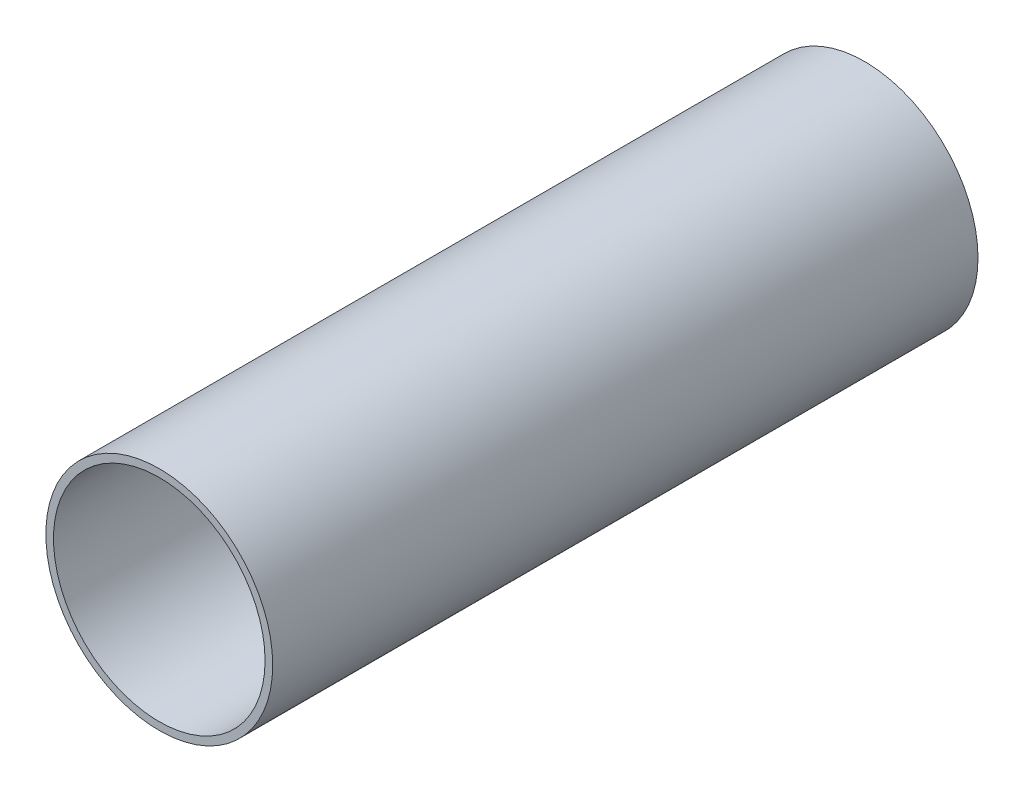
ISO-10303-21;
HEADER;
FILE_DESCRIPTION(('STEP AP214'),'2;1');
FILE_NAME('part.step','',(''),(''),'','','');
FILE_SCHEMA(('AUTOMOTIVE_DESIGN { 1 0 10303 214 1 1 1 1 }'));
ENDSEC;
DATA;
#1=APPLICATION_CONTEXT('core data for automotive mechanical design processes');
#2=APPLICATION_PROTOCOL_DEFINITION('international standard','automotive_design',2000,#1);
#3=PRODUCT_CONTEXT('',#1,'mechanical');
#4=PRODUCT('Part','Part','',(#3));
#5=PRODUCT_RELATED_PRODUCT_CATEGORY('part','',(#4));
#6=PRODUCT_DEFINITION_FORMATION('','',#4);
#7=PRODUCT_DEFINITION_CONTEXT('part definition',#1,'design');
#8=PRODUCT_DEFINITION('design','',#6,#7);
#9=PRODUCT_DEFINITION_SHAPE('','',#8);
#10=(LENGTH_UNIT() NAMED_UNIT(*) SI_UNIT(.MILLI.,.METRE.));
#11=(NAMED_UNIT(*) PLANE_ANGLE_UNIT() SI_UNIT($,.RADIAN.));
#12=(NAMED_UNIT(*) SI_UNIT($,.STERADIAN.) SOLID_ANGLE_UNIT());
#13=UNCERTAINTY_MEASURE_WITH_UNIT(LENGTH_MEASURE(1.E-05),#10,'distance_accuracy_value','');
#14=(GEOMETRIC_REPRESENTATION_CONTEXT(3) GLOBAL_UNCERTAINTY_ASSIGNED_CONTEXT((#13)) GLOBAL_UNIT_ASSIGNED_CONTEXT((#10,
#11,#12)) REPRESENTATION_CONTEXT('',''));
#15=CARTESIAN_POINT('',(0.,0.,0.));
#16=DIRECTION('',(0.,0.,1.));
#17=DIRECTION('',(1.,0.,0.));
#18=AXIS2_PLACEMENT_3D('',#15,#16,#17);
#19=CARTESIAN_POINT('',(0.,0.,60.));
#20=DIRECTION('',(0.,0.,1.));
#21=DIRECTION('',(1.,0.,0.));
#22=AXIS2_PLACEMENT_3D('',#19,#20,#21);
#23=PLANE('',#22);
#24=CARTESIAN_POINT('',(0.,0.,60.));
#25=DIRECTION('',(0.,0.,1.));
#26=DIRECTION('',(1.,0.,0.));
#27=AXIS2_PLACEMENT_3D('',#24,#25,#26);
#28=CIRCLE('',#27,9.65);
#29=CARTESIAN_POINT('',(9.65,0.,60.));
#30=VERTEX_POINT('',#29);
#31=EDGE_CURVE('E12',#30,#30,#28,.T.);
#32=ORIENTED_EDGE('',*,*,#31,.T.);
#33=EDGE_LOOP('',(#32));
#34=FACE_BOUND('',#33,.T.);
#35=CARTESIAN_POINT('',(0.,0.,60.));
#36=DIRECTION('',(0.,0.,1.));
#37=DIRECTION('',(1.,0.,0.));
#38=AXIS2_PLACEMENT_3D('',#35,#36,#37);
#39=CIRCLE('',#38,9.);
#40=CARTESIAN_POINT('',(9.,0.,60.));
#41=VERTEX_POINT('',#40);
#42=EDGE_CURVE('E63',#41,#41,#39,.T.);
#43=ORIENTED_EDGE('',*,*,#42,.F.);
#44=EDGE_LOOP('',(#43));
#45=FACE_BOUND('',#44,.T.);
#46=ADVANCED_FACE('F50',(#34,#45),#23,.T.);
#47=CARTESIAN_POINT('',(0.,0.,0.));
#48=DIRECTION('',(0.,0.,1.));
#49=DIRECTION('',(1.,0.,0.));
#50=AXIS2_PLACEMENT_3D('',#47,#48,#49);
#51=PLANE('',#50);
#52=CARTESIAN_POINT('',(0.,0.,0.));
#53=DIRECTION('',(0.,0.,1.));
#54=DIRECTION('',(1.,0.,0.));
#55=AXIS2_PLACEMENT_3D('',#52,#53,#54);
#56=CIRCLE('',#55,9.65);
#57=CARTESIAN_POINT('',(9.65,0.,0.));
#58=VERTEX_POINT('',#57);
#59=EDGE_CURVE('E54',#58,#58,#56,.T.);
#60=ORIENTED_EDGE('',*,*,#59,.F.);
#61=EDGE_LOOP('',(#60));
#62=FACE_BOUND('',#61,.T.);
#63=CARTESIAN_POINT('',(0.,0.,0.));
#64=DIRECTION('',(0.,0.,1.));
#65=DIRECTION('',(1.,0.,0.));
#66=AXIS2_PLACEMENT_3D('',#63,#64,#65);
#67=CIRCLE('',#66,9.);
#68=CARTESIAN_POINT('',(9.,0.,0.));
#69=VERTEX_POINT('',#68);
#70=EDGE_CURVE('E65',#69,#69,#67,.T.);
#71=ORIENTED_EDGE('',*,*,#70,.T.);
#72=EDGE_LOOP('',(#71));
#73=FACE_BOUND('',#72,.T.);
#74=ADVANCED_FACE('F77',(#62,#73),#51,.F.);
#75=CARTESIAN_POINT('',(0.,0.,60.));
#76=DIRECTION('',(0.,0.,-1.));
#77=DIRECTION('',(-1.,0.,0.));
#78=AXIS2_PLACEMENT_3D('',#75,#76,#77);
#79=CYLINDRICAL_SURFACE('',#78,9.65);
#80=ORIENTED_EDGE('',*,*,#31,.F.);
#81=EDGE_LOOP('',(#80));
#82=FACE_BOUND('',#81,.T.);
#83=ORIENTED_EDGE('',*,*,#59,.T.);
#84=EDGE_LOOP('',(#83));
#85=FACE_BOUND('',#84,.T.);
#86=ADVANCED_FACE('F52',(#82,#85),#79,.T.);
#87=CARTESIAN_POINT('',(0.,0.,60.));
#88=DIRECTION('',(0.,0.,-1.));
#89=DIRECTION('',(-1.,0.,0.));
#90=AXIS2_PLACEMENT_3D('',#87,#88,#89);
#91=CYLINDRICAL_SURFACE('',#90,9.);
#92=ORIENTED_EDGE('',*,*,#42,.T.);
#93=EDGE_LOOP('',(#92));
#94=FACE_BOUND('',#93,.T.);
#95=ORIENTED_EDGE('',*,*,#70,.F.);
#96=EDGE_LOOP('',(#95));
#97=FACE_BOUND('',#96,.T.);
#98=ADVANCED_FACE('F73',(#94,#97),#91,.F.);
#99=CLOSED_SHELL('',(#46,#74,#86,#98));
#100=MANIFOLD_SOLID_BREP('B2',#99);
#101=ADVANCED_BREP_SHAPE_REPRESENTATION('',(#18,#100),#14);
#102=SHAPE_DEFINITION_REPRESENTATION(#9,#101);
ENDSEC;
END-ISO-10303-21;
